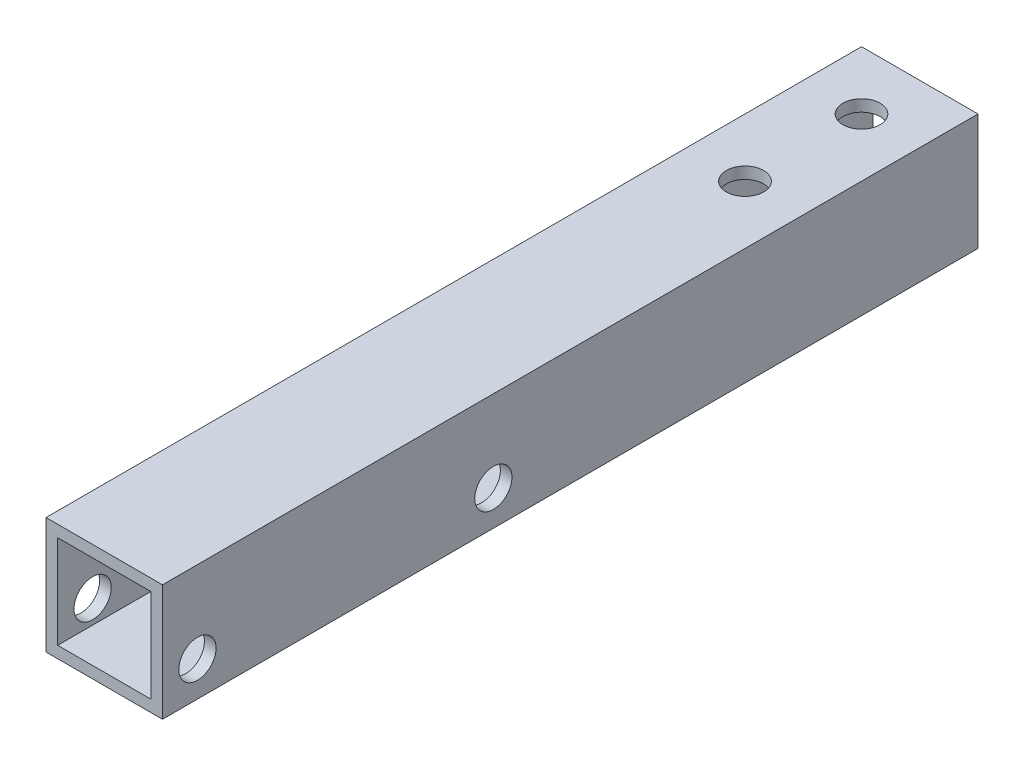
ISO-10303-21;
HEADER;
FILE_DESCRIPTION(('STEP AP214'),'2;1');
FILE_NAME('part.step','',(''),(''),'','','');
FILE_SCHEMA(('AUTOMOTIVE_DESIGN { 1 0 10303 214 1 1 1 1 }'));
ENDSEC;
DATA;
#1=APPLICATION_CONTEXT('core data for automotive mechanical design processes');
#2=APPLICATION_PROTOCOL_DEFINITION('international standard','automotive_design',2000,#1);
#3=PRODUCT_CONTEXT('',#1,'mechanical');
#4=PRODUCT('Part','Part','',(#3));
#5=PRODUCT_RELATED_PRODUCT_CATEGORY('part','',(#4));
#6=PRODUCT_DEFINITION_FORMATION('','',#4);
#7=PRODUCT_DEFINITION_CONTEXT('part definition',#1,'design');
#8=PRODUCT_DEFINITION('design','',#6,#7);
#9=PRODUCT_DEFINITION_SHAPE('','',#8);
#10=(LENGTH_UNIT() NAMED_UNIT(*) SI_UNIT(.MILLI.,.METRE.));
#11=(NAMED_UNIT(*) PLANE_ANGLE_UNIT() SI_UNIT($,.RADIAN.));
#12=(NAMED_UNIT(*) SI_UNIT($,.STERADIAN.) SOLID_ANGLE_UNIT());
#13=UNCERTAINTY_MEASURE_WITH_UNIT(LENGTH_MEASURE(1.E-05),#10,'distance_accuracy_value','');
#14=(GEOMETRIC_REPRESENTATION_CONTEXT(3) GLOBAL_UNCERTAINTY_ASSIGNED_CONTEXT((#13)) GLOBAL_UNIT_ASSIGNED_CONTEXT((#10,
#11,#12)) REPRESENTATION_CONTEXT('',''));
#15=CARTESIAN_POINT('',(0.,0.,0.));
#16=DIRECTION('',(0.,0.,1.));
#17=DIRECTION('',(1.,0.,0.));
#18=AXIS2_PLACEMENT_3D('',#15,#16,#17);
#19=CARTESIAN_POINT('',(0.,0.,70.));
#20=DIRECTION('',(0.,0.,1.));
#21=DIRECTION('',(1.,0.,0.));
#22=AXIS2_PLACEMENT_3D('',#19,#20,#21);
#23=PLANE('',#22);
#24=DIRECTION('',(0.,-1.,0.));
#25=VECTOR('',#24,1.);
#26=CARTESIAN_POINT('',(-5.,5.,70.));
#27=LINE('',#26,#25);
#28=CARTESIAN_POINT('',(-5.,5.,70.));
#29=VERTEX_POINT('',#28);
#30=CARTESIAN_POINT('',(-5.,-5.,70.));
#31=VERTEX_POINT('',#30);
#32=EDGE_CURVE('E164',#29,#31,#27,.T.);
#33=ORIENTED_EDGE('',*,*,#32,.T.);
#34=DIRECTION('',(1.,0.,0.));
#35=VECTOR('',#34,1.);
#36=CARTESIAN_POINT('',(5.,-5.,70.));
#37=LINE('',#36,#35);
#38=CARTESIAN_POINT('',(5.,-5.,70.));
#39=VERTEX_POINT('',#38);
#40=EDGE_CURVE('E167',#31,#39,#37,.T.);
#41=ORIENTED_EDGE('',*,*,#40,.T.);
#42=DIRECTION('',(0.,1.,0.));
#43=VECTOR('',#42,1.);
#44=CARTESIAN_POINT('',(5.,5.,70.));
#45=LINE('',#44,#43);
#46=CARTESIAN_POINT('',(5.,5.,70.));
#47=VERTEX_POINT('',#46);
#48=EDGE_CURVE('E170',#39,#47,#45,.T.);
#49=ORIENTED_EDGE('',*,*,#48,.T.);
#50=DIRECTION('',(-1.,0.,0.));
#51=VECTOR('',#50,1.);
#52=CARTESIAN_POINT('',(5.,5.,70.));
#53=LINE('',#52,#51);
#54=EDGE_CURVE('E172',#47,#29,#53,.T.);
#55=ORIENTED_EDGE('',*,*,#54,.T.);
#56=EDGE_LOOP('',(#33,#41,#49,#55));
#57=FACE_BOUND('',#56,.T.);
#58=DIRECTION('',(1.,0.,0.));
#59=VECTOR('',#58,1.);
#60=CARTESIAN_POINT('',(0.,-4.,70.));
#61=LINE('',#60,#59);
#62=CARTESIAN_POINT('',(-4.,-4.,70.));
#63=VERTEX_POINT('',#62);
#64=CARTESIAN_POINT('',(4.,-4.,70.));
#65=VERTEX_POINT('',#64);
#66=EDGE_CURVE('E134',#63,#65,#61,.T.);
#67=ORIENTED_EDGE('',*,*,#66,.F.);
#68=DIRECTION('',(0.,-1.,0.));
#69=VECTOR('',#68,1.);
#70=CARTESIAN_POINT('',(-4.,0.,70.));
#71=LINE('',#70,#69);
#72=CARTESIAN_POINT('',(-4.,4.,70.));
#73=VERTEX_POINT('',#72);
#74=EDGE_CURVE('E126',#73,#63,#71,.T.);
#75=ORIENTED_EDGE('',*,*,#74,.F.);
#76=DIRECTION('',(-1.,0.,0.));
#77=VECTOR('',#76,1.);
#78=CARTESIAN_POINT('',(0.,4.,70.));
#79=LINE('',#78,#77);
#80=CARTESIAN_POINT('',(4.,4.,70.));
#81=VERTEX_POINT('',#80);
#82=EDGE_CURVE('E148',#81,#73,#79,.T.);
#83=ORIENTED_EDGE('',*,*,#82,.F.);
#84=DIRECTION('',(0.,1.,0.));
#85=VECTOR('',#84,1.);
#86=CARTESIAN_POINT('',(4.,0.,70.));
#87=LINE('',#86,#85);
#88=EDGE_CURVE('E146',#65,#81,#87,.T.);
#89=ORIENTED_EDGE('',*,*,#88,.F.);
#90=EDGE_LOOP('',(#67,#75,#83,#89));
#91=FACE_BOUND('',#90,.T.);
#92=ADVANCED_FACE('F59',(#57,#91),#23,.T.);
#93=CARTESIAN_POINT('',(0.,0.,0.));
#94=DIRECTION('',(0.,0.,1.));
#95=DIRECTION('',(1.,0.,0.));
#96=AXIS2_PLACEMENT_3D('',#93,#94,#95);
#97=PLANE('',#96);
#98=DIRECTION('',(0.,-1.,0.));
#99=VECTOR('',#98,1.);
#100=CARTESIAN_POINT('',(-5.,5.,0.));
#101=LINE('',#100,#99);
#102=CARTESIAN_POINT('',(-5.,5.,0.));
#103=VERTEX_POINT('',#102);
#104=CARTESIAN_POINT('',(-5.,-5.,0.));
#105=VERTEX_POINT('',#104);
#106=EDGE_CURVE('E142',#103,#105,#101,.T.);
#107=ORIENTED_EDGE('',*,*,#106,.F.);
#108=DIRECTION('',(-1.,0.,0.));
#109=VECTOR('',#108,1.);
#110=CARTESIAN_POINT('',(5.,5.,0.));
#111=LINE('',#110,#109);
#112=CARTESIAN_POINT('',(5.,5.,0.));
#113=VERTEX_POINT('',#112);
#114=EDGE_CURVE('E168',#113,#103,#111,.T.);
#115=ORIENTED_EDGE('',*,*,#114,.F.);
#116=DIRECTION('',(0.,1.,0.));
#117=VECTOR('',#116,1.);
#118=CARTESIAN_POINT('',(5.,5.,0.));
#119=LINE('',#118,#117);
#120=CARTESIAN_POINT('',(5.,-5.,0.));
#121=VERTEX_POINT('',#120);
#122=EDGE_CURVE('E179',#121,#113,#119,.T.);
#123=ORIENTED_EDGE('',*,*,#122,.F.);
#124=DIRECTION('',(1.,0.,0.));
#125=VECTOR('',#124,1.);
#126=CARTESIAN_POINT('',(5.,-5.,0.));
#127=LINE('',#126,#125);
#128=EDGE_CURVE('E177',#105,#121,#127,.T.);
#129=ORIENTED_EDGE('',*,*,#128,.F.);
#130=EDGE_LOOP('',(#107,#115,#123,#129));
#131=FACE_BOUND('',#130,.T.);
#132=DIRECTION('',(0.,-1.,0.));
#133=VECTOR('',#132,1.);
#134=CARTESIAN_POINT('',(-4.,0.,0.));
#135=LINE('',#134,#133);
#136=CARTESIAN_POINT('',(-4.,4.,0.));
#137=VERTEX_POINT('',#136);
#138=CARTESIAN_POINT('',(-4.,-4.,0.));
#139=VERTEX_POINT('',#138);
#140=EDGE_CURVE('E84',#137,#139,#135,.T.);
#141=ORIENTED_EDGE('',*,*,#140,.T.);
#142=DIRECTION('',(1.,0.,0.));
#143=VECTOR('',#142,1.);
#144=CARTESIAN_POINT('',(0.,-4.,0.));
#145=LINE('',#144,#143);
#146=CARTESIAN_POINT('',(4.,-4.,0.));
#147=VERTEX_POINT('',#146);
#148=EDGE_CURVE('E141',#139,#147,#145,.T.);
#149=ORIENTED_EDGE('',*,*,#148,.T.);
#150=DIRECTION('',(0.,1.,0.));
#151=VECTOR('',#150,1.);
#152=CARTESIAN_POINT('',(4.,0.,0.));
#153=LINE('',#152,#151);
#154=CARTESIAN_POINT('',(4.,4.,0.));
#155=VERTEX_POINT('',#154);
#156=EDGE_CURVE('E156',#147,#155,#153,.T.);
#157=ORIENTED_EDGE('',*,*,#156,.T.);
#158=DIRECTION('',(-1.,0.,0.));
#159=VECTOR('',#158,1.);
#160=CARTESIAN_POINT('',(0.,4.,0.));
#161=LINE('',#160,#159);
#162=EDGE_CURVE('E135',#155,#137,#161,.T.);
#163=ORIENTED_EDGE('',*,*,#162,.T.);
#164=EDGE_LOOP('',(#141,#149,#157,#163));
#165=FACE_BOUND('',#164,.T.);
#166=ADVANCED_FACE('F259',(#131,#165),#97,.F.);
#167=CARTESIAN_POINT('',(-5.,5.,70.));
#168=DIRECTION('',(1.,0.,0.));
#169=DIRECTION('',(0.,1.,0.));
#170=AXIS2_PLACEMENT_3D('',#167,#168,#169);
#171=PLANE('',#170);
#172=CARTESIAN_POINT('',(-5.,-2.,67.));
#173=DIRECTION('',(-1.,0.,0.));
#174=DIRECTION('',(0.,-1.,0.));
#175=AXIS2_PLACEMENT_3D('',#172,#173,#174);
#176=CIRCLE('',#175,1.60000000000001);
#177=CARTESIAN_POINT('',(-5.,-3.60000000000001,67.));
#178=VERTEX_POINT('',#177);
#179=EDGE_CURVE('E207',#178,#178,#176,.T.);
#180=ORIENTED_EDGE('',*,*,#179,.F.);
#181=EDGE_LOOP('',(#180));
#182=FACE_BOUND('',#181,.T.);
#183=CARTESIAN_POINT('',(-5.,-2.,41.6));
#184=DIRECTION('',(-1.,0.,0.));
#185=DIRECTION('',(0.,-1.,0.));
#186=AXIS2_PLACEMENT_3D('',#183,#184,#185);
#187=CIRCLE('',#186,1.6);
#188=CARTESIAN_POINT('',(-5.,-3.6,41.6));
#189=VERTEX_POINT('',#188);
#190=EDGE_CURVE('E217',#189,#189,#187,.T.);
#191=ORIENTED_EDGE('',*,*,#190,.F.);
#192=EDGE_LOOP('',(#191));
#193=FACE_BOUND('',#192,.T.);
#194=ORIENTED_EDGE('',*,*,#106,.T.);
#195=DIRECTION('',(0.,0.,-1.));
#196=VECTOR('',#195,1.);
#197=CARTESIAN_POINT('',(-5.,-5.,70.));
#198=LINE('',#197,#196);
#199=EDGE_CURVE('E12',#31,#105,#198,.T.);
#200=ORIENTED_EDGE('',*,*,#199,.F.);
#201=ORIENTED_EDGE('',*,*,#32,.F.);
#202=DIRECTION('',(0.,0.,-1.));
#203=VECTOR('',#202,1.);
#204=CARTESIAN_POINT('',(-5.,5.,70.));
#205=LINE('',#204,#203);
#206=EDGE_CURVE('E174',#29,#103,#205,.T.);
#207=ORIENTED_EDGE('',*,*,#206,.T.);
#208=EDGE_LOOP('',(#194,#200,#201,#207));
#209=FACE_BOUND('',#208,.T.);
#210=ADVANCED_FACE('F61',(#182,#193,#209),#171,.F.);
#211=CARTESIAN_POINT('',(5.,-5.,70.));
#212=DIRECTION('',(0.,1.,0.));
#213=DIRECTION('',(-1.,0.,0.));
#214=AXIS2_PLACEMENT_3D('',#211,#212,#213);
#215=PLANE('',#214);
#216=CARTESIAN_POINT('',(0.,-5.,5.));
#217=DIRECTION('',(0.,1.,0.));
#218=DIRECTION('',(-1.,0.,0.));
#219=AXIS2_PLACEMENT_3D('',#216,#217,#218);
#220=CIRCLE('',#219,1.6);
#221=CARTESIAN_POINT('',(-1.6,-5.,5.));
#222=VERTEX_POINT('',#221);
#223=EDGE_CURVE('E193',#222,#222,#220,.T.);
#224=ORIENTED_EDGE('',*,*,#223,.T.);
#225=EDGE_LOOP('',(#224));
#226=FACE_BOUND('',#225,.T.);
#227=CARTESIAN_POINT('',(0.,-5.,15.));
#228=DIRECTION('',(0.,1.,0.));
#229=DIRECTION('',(-1.,0.,0.));
#230=AXIS2_PLACEMENT_3D('',#227,#228,#229);
#231=CIRCLE('',#230,1.6);
#232=CARTESIAN_POINT('',(-1.6,-5.,15.));
#233=VERTEX_POINT('',#232);
#234=EDGE_CURVE('E223',#233,#233,#231,.T.);
#235=ORIENTED_EDGE('',*,*,#234,.T.);
#236=EDGE_LOOP('',(#235));
#237=FACE_BOUND('',#236,.T.);
#238=ORIENTED_EDGE('',*,*,#128,.T.);
#239=DIRECTION('',(0.,0.,-1.));
#240=VECTOR('',#239,1.);
#241=CARTESIAN_POINT('',(5.,-5.,70.));
#242=LINE('',#241,#240);
#243=EDGE_CURVE('E68',#39,#121,#242,.T.);
#244=ORIENTED_EDGE('',*,*,#243,.F.);
#245=ORIENTED_EDGE('',*,*,#40,.F.);
#246=ORIENTED_EDGE('',*,*,#199,.T.);
#247=EDGE_LOOP('',(#238,#244,#245,#246));
#248=FACE_BOUND('',#247,.T.);
#249=ADVANCED_FACE('F274',(#226,#237,#248),#215,.F.);
#250=CARTESIAN_POINT('',(5.,5.,70.));
#251=DIRECTION('',(-1.,0.,0.));
#252=DIRECTION('',(0.,-1.,0.));
#253=AXIS2_PLACEMENT_3D('',#250,#251,#252);
#254=PLANE('',#253);
#255=CARTESIAN_POINT('',(5.,-2.,67.));
#256=DIRECTION('',(-1.,0.,0.));
#257=DIRECTION('',(0.,-1.,0.));
#258=AXIS2_PLACEMENT_3D('',#255,#256,#257);
#259=CIRCLE('',#258,1.60000000000001);
#260=CARTESIAN_POINT('',(5.,-3.60000000000001,67.));
#261=VERTEX_POINT('',#260);
#262=EDGE_CURVE('E201',#261,#261,#259,.T.);
#263=ORIENTED_EDGE('',*,*,#262,.T.);
#264=EDGE_LOOP('',(#263));
#265=FACE_BOUND('',#264,.T.);
#266=CARTESIAN_POINT('',(5.,-2.,41.6));
#267=DIRECTION('',(-1.,0.,0.));
#268=DIRECTION('',(0.,-1.,0.));
#269=AXIS2_PLACEMENT_3D('',#266,#267,#268);
#270=CIRCLE('',#269,1.6);
#271=CARTESIAN_POINT('',(5.,-3.6,41.6));
#272=VERTEX_POINT('',#271);
#273=EDGE_CURVE('E212',#272,#272,#270,.T.);
#274=ORIENTED_EDGE('',*,*,#273,.T.);
#275=EDGE_LOOP('',(#274));
#276=FACE_BOUND('',#275,.T.);
#277=ORIENTED_EDGE('',*,*,#122,.T.);
#278=DIRECTION('',(0.,0.,-1.));
#279=VECTOR('',#278,1.);
#280=CARTESIAN_POINT('',(5.,5.,70.));
#281=LINE('',#280,#279);
#282=EDGE_CURVE('E184',#47,#113,#281,.T.);
#283=ORIENTED_EDGE('',*,*,#282,.F.);
#284=ORIENTED_EDGE('',*,*,#48,.F.);
#285=ORIENTED_EDGE('',*,*,#243,.T.);
#286=EDGE_LOOP('',(#277,#283,#284,#285));
#287=FACE_BOUND('',#286,.T.);
#288=ADVANCED_FACE('F272',(#265,#276,#287),#254,.F.);
#289=CARTESIAN_POINT('',(5.,5.,70.));
#290=DIRECTION('',(0.,-1.,0.));
#291=DIRECTION('',(1.,0.,0.));
#292=AXIS2_PLACEMENT_3D('',#289,#290,#291);
#293=PLANE('',#292);
#294=CARTESIAN_POINT('',(0.,5.,5.));
#295=DIRECTION('',(0.,-1.,0.));
#296=DIRECTION('',(1.,0.,0.));
#297=AXIS2_PLACEMENT_3D('',#294,#295,#296);
#298=CIRCLE('',#297,1.6);
#299=CARTESIAN_POINT('',(-1.6,5.,5.));
#300=VERTEX_POINT('',#299);
#301=EDGE_CURVE('E154',#300,#300,#298,.T.);
#302=ORIENTED_EDGE('',*,*,#301,.T.);
#303=EDGE_LOOP('',(#302));
#304=FACE_BOUND('',#303,.T.);
#305=CARTESIAN_POINT('',(0.,5.,15.));
#306=DIRECTION('',(0.,-1.,0.));
#307=DIRECTION('',(1.,0.,0.));
#308=AXIS2_PLACEMENT_3D('',#305,#306,#307);
#309=CIRCLE('',#308,1.6);
#310=CARTESIAN_POINT('',(-1.6,5.,15.));
#311=VERTEX_POINT('',#310);
#312=EDGE_CURVE('E197',#311,#311,#309,.T.);
#313=ORIENTED_EDGE('',*,*,#312,.T.);
#314=EDGE_LOOP('',(#313));
#315=FACE_BOUND('',#314,.T.);
#316=ORIENTED_EDGE('',*,*,#114,.T.);
#317=ORIENTED_EDGE('',*,*,#206,.F.);
#318=ORIENTED_EDGE('',*,*,#54,.F.);
#319=ORIENTED_EDGE('',*,*,#282,.T.);
#320=EDGE_LOOP('',(#316,#317,#318,#319));
#321=FACE_BOUND('',#320,.T.);
#322=ADVANCED_FACE('F236',(#304,#315,#321),#293,.F.);
#323=CARTESIAN_POINT('',(-4.,0.,70.));
#324=DIRECTION('',(1.,0.,0.));
#325=DIRECTION('',(0.,1.,0.));
#326=AXIS2_PLACEMENT_3D('',#323,#324,#325);
#327=PLANE('',#326);
#328=CARTESIAN_POINT('',(-4.,-2.,67.));
#329=DIRECTION('',(1.,0.,0.));
#330=DIRECTION('',(0.,1.,0.));
#331=AXIS2_PLACEMENT_3D('',#328,#329,#330);
#332=CIRCLE('',#331,1.60000000000001);
#333=CARTESIAN_POINT('',(-4.,-0.399999999999996,67.));
#334=VERTEX_POINT('',#333);
#335=EDGE_CURVE('E220',#334,#334,#332,.T.);
#336=ORIENTED_EDGE('',*,*,#335,.F.);
#337=EDGE_LOOP('',(#336));
#338=FACE_BOUND('',#337,.T.);
#339=CARTESIAN_POINT('',(-4.,-2.,41.6));
#340=DIRECTION('',(1.,0.,0.));
#341=DIRECTION('',(0.,1.,0.));
#342=AXIS2_PLACEMENT_3D('',#339,#340,#341);
#343=CIRCLE('',#342,1.6);
#344=CARTESIAN_POINT('',(-4.,-0.400000000000003,41.6));
#345=VERTEX_POINT('',#344);
#346=EDGE_CURVE('E200',#345,#345,#343,.T.);
#347=ORIENTED_EDGE('',*,*,#346,.F.);
#348=EDGE_LOOP('',(#347));
#349=FACE_BOUND('',#348,.T.);
#350=ORIENTED_EDGE('',*,*,#140,.F.);
#351=DIRECTION('',(0.,0.,-1.));
#352=VECTOR('',#351,1.);
#353=CARTESIAN_POINT('',(-4.,4.,70.));
#354=LINE('',#353,#352);
#355=EDGE_CURVE('E130',#73,#137,#354,.T.);
#356=ORIENTED_EDGE('',*,*,#355,.F.);
#357=ORIENTED_EDGE('',*,*,#74,.T.);
#358=DIRECTION('',(0.,0.,-1.));
#359=VECTOR('',#358,1.);
#360=CARTESIAN_POINT('',(-4.,-4.,70.));
#361=LINE('',#360,#359);
#362=EDGE_CURVE('E129',#63,#139,#361,.T.);
#363=ORIENTED_EDGE('',*,*,#362,.T.);
#364=EDGE_LOOP('',(#350,#356,#357,#363));
#365=FACE_BOUND('',#364,.T.);
#366=ADVANCED_FACE('F128',(#338,#349,#365),#327,.T.);
#367=CARTESIAN_POINT('',(0.,-4.,70.));
#368=DIRECTION('',(0.,1.,0.));
#369=DIRECTION('',(-1.,0.,0.));
#370=AXIS2_PLACEMENT_3D('',#367,#368,#369);
#371=PLANE('',#370);
#372=CARTESIAN_POINT('',(0.,-4.,5.));
#373=DIRECTION('',(0.,1.,0.));
#374=DIRECTION('',(-1.,0.,0.));
#375=AXIS2_PLACEMENT_3D('',#372,#373,#374);
#376=CIRCLE('',#375,1.6);
#377=CARTESIAN_POINT('',(-1.6,-4.,5.));
#378=VERTEX_POINT('',#377);
#379=EDGE_CURVE('E196',#378,#378,#376,.T.);
#380=ORIENTED_EDGE('',*,*,#379,.F.);
#381=EDGE_LOOP('',(#380));
#382=FACE_BOUND('',#381,.T.);
#383=CARTESIAN_POINT('',(0.,-4.,15.));
#384=DIRECTION('',(0.,1.,0.));
#385=DIRECTION('',(-1.,0.,0.));
#386=AXIS2_PLACEMENT_3D('',#383,#384,#385);
#387=CIRCLE('',#386,1.6);
#388=CARTESIAN_POINT('',(-1.6,-4.,15.));
#389=VERTEX_POINT('',#388);
#390=EDGE_CURVE('E192',#389,#389,#387,.T.);
#391=ORIENTED_EDGE('',*,*,#390,.F.);
#392=EDGE_LOOP('',(#391));
#393=FACE_BOUND('',#392,.T.);
#394=ORIENTED_EDGE('',*,*,#148,.F.);
#395=ORIENTED_EDGE('',*,*,#362,.F.);
#396=ORIENTED_EDGE('',*,*,#66,.T.);
#397=DIRECTION('',(0.,0.,-1.));
#398=VECTOR('',#397,1.);
#399=CARTESIAN_POINT('',(4.,-4.,70.));
#400=LINE('',#399,#398);
#401=EDGE_CURVE('E143',#65,#147,#400,.T.);
#402=ORIENTED_EDGE('',*,*,#401,.T.);
#403=EDGE_LOOP('',(#394,#395,#396,#402));
#404=FACE_BOUND('',#403,.T.);
#405=ADVANCED_FACE('F138',(#382,#393,#404),#371,.T.);
#406=CARTESIAN_POINT('',(4.,0.,70.));
#407=DIRECTION('',(-1.,0.,0.));
#408=DIRECTION('',(0.,-1.,0.));
#409=AXIS2_PLACEMENT_3D('',#406,#407,#408);
#410=PLANE('',#409);
#411=CARTESIAN_POINT('',(4.,-2.,67.));
#412=DIRECTION('',(-1.,0.,0.));
#413=DIRECTION('',(0.,-1.,0.));
#414=AXIS2_PLACEMENT_3D('',#411,#412,#413);
#415=CIRCLE('',#414,1.60000000000001);
#416=CARTESIAN_POINT('',(4.,-3.60000000000001,67.));
#417=VERTEX_POINT('',#416);
#418=EDGE_CURVE('E63',#417,#417,#415,.T.);
#419=ORIENTED_EDGE('',*,*,#418,.F.);
#420=EDGE_LOOP('',(#419));
#421=FACE_BOUND('',#420,.T.);
#422=CARTESIAN_POINT('',(4.,-2.,41.6));
#423=DIRECTION('',(-1.,0.,0.));
#424=DIRECTION('',(0.,-1.,0.));
#425=AXIS2_PLACEMENT_3D('',#422,#423,#424);
#426=CIRCLE('',#425,1.6);
#427=CARTESIAN_POINT('',(4.,-3.6,41.6));
#428=VERTEX_POINT('',#427);
#429=EDGE_CURVE('E198',#428,#428,#426,.T.);
#430=ORIENTED_EDGE('',*,*,#429,.F.);
#431=EDGE_LOOP('',(#430));
#432=FACE_BOUND('',#431,.T.);
#433=ORIENTED_EDGE('',*,*,#156,.F.);
#434=ORIENTED_EDGE('',*,*,#401,.F.);
#435=ORIENTED_EDGE('',*,*,#88,.T.);
#436=DIRECTION('',(0.,0.,-1.));
#437=VECTOR('',#436,1.);
#438=CARTESIAN_POINT('',(4.,4.,70.));
#439=LINE('',#438,#437);
#440=EDGE_CURVE('E76',#81,#155,#439,.T.);
#441=ORIENTED_EDGE('',*,*,#440,.T.);
#442=EDGE_LOOP('',(#433,#434,#435,#441));
#443=FACE_BOUND('',#442,.T.);
#444=ADVANCED_FACE('F301',(#421,#432,#443),#410,.T.);
#445=CARTESIAN_POINT('',(0.,4.,70.));
#446=DIRECTION('',(0.,-1.,0.));
#447=DIRECTION('',(1.,0.,0.));
#448=AXIS2_PLACEMENT_3D('',#445,#446,#447);
#449=PLANE('',#448);
#450=CARTESIAN_POINT('',(0.,4.,5.));
#451=DIRECTION('',(0.,-1.,0.));
#452=DIRECTION('',(1.,0.,0.));
#453=AXIS2_PLACEMENT_3D('',#450,#451,#452);
#454=CIRCLE('',#453,1.6);
#455=CARTESIAN_POINT('',(-1.6,4.,5.));
#456=VERTEX_POINT('',#455);
#457=EDGE_CURVE('E194',#456,#456,#454,.T.);
#458=ORIENTED_EDGE('',*,*,#457,.F.);
#459=EDGE_LOOP('',(#458));
#460=FACE_BOUND('',#459,.T.);
#461=CARTESIAN_POINT('',(0.,4.,15.));
#462=DIRECTION('',(0.,-1.,0.));
#463=DIRECTION('',(1.,0.,0.));
#464=AXIS2_PLACEMENT_3D('',#461,#462,#463);
#465=CIRCLE('',#464,1.6);
#466=CARTESIAN_POINT('',(-1.6,4.,15.));
#467=VERTEX_POINT('',#466);
#468=EDGE_CURVE('E189',#467,#467,#465,.T.);
#469=ORIENTED_EDGE('',*,*,#468,.F.);
#470=EDGE_LOOP('',(#469));
#471=FACE_BOUND('',#470,.T.);
#472=ORIENTED_EDGE('',*,*,#162,.F.);
#473=ORIENTED_EDGE('',*,*,#440,.F.);
#474=ORIENTED_EDGE('',*,*,#82,.T.);
#475=ORIENTED_EDGE('',*,*,#355,.T.);
#476=EDGE_LOOP('',(#472,#473,#474,#475));
#477=FACE_BOUND('',#476,.T.);
#478=ADVANCED_FACE('F252',(#460,#471,#477),#449,.T.);
#479=CARTESIAN_POINT('',(0.,-5.,15.));
#480=DIRECTION('',(0.,1.,0.));
#481=DIRECTION('',(-1.,0.,0.));
#482=AXIS2_PLACEMENT_3D('',#479,#480,#481);
#483=CYLINDRICAL_SURFACE('',#482,1.6);
#484=CARTESIAN_POINT('',(-1.6,4.,15.));
#485=CARTESIAN_POINT('',(-1.6,4.01041666666667,15.));
#486=CARTESIAN_POINT('',(-1.6,4.02083333333333,15.));
#487=CARTESIAN_POINT('',(-1.6,4.04166666666667,15.));
#488=CARTESIAN_POINT('',(-1.6,4.05208333333333,15.));
#489=CARTESIAN_POINT('',(-1.6,4.07291666666667,15.));
#490=CARTESIAN_POINT('',(-1.6,4.08333333333333,15.));
#491=CARTESIAN_POINT('',(-1.6,4.10416666666667,15.));
#492=CARTESIAN_POINT('',(-1.6,4.11458333333333,15.));
#493=CARTESIAN_POINT('',(-1.6,4.13541666666667,15.));
#494=CARTESIAN_POINT('',(-1.6,4.14583333333333,15.));
#495=CARTESIAN_POINT('',(-1.6,4.16666666666667,15.));
#496=CARTESIAN_POINT('',(-1.6,4.17708333333333,15.));
#497=CARTESIAN_POINT('',(-1.6,4.19791666666667,15.));
#498=CARTESIAN_POINT('',(-1.6,4.20833333333333,15.));
#499=CARTESIAN_POINT('',(-1.6,4.22916666666667,15.));
#500=CARTESIAN_POINT('',(-1.6,4.23958333333333,15.));
#501=CARTESIAN_POINT('',(-1.6,4.26041666666667,15.));
#502=CARTESIAN_POINT('',(-1.6,4.27083333333333,15.));
#503=CARTESIAN_POINT('',(-1.6,4.29166666666667,15.));
#504=CARTESIAN_POINT('',(-1.6,4.30208333333333,15.));
#505=CARTESIAN_POINT('',(-1.6,4.32291666666667,15.));
#506=CARTESIAN_POINT('',(-1.6,4.33333333333333,15.));
#507=CARTESIAN_POINT('',(-1.6,4.35416666666667,15.));
#508=CARTESIAN_POINT('',(-1.6,4.36458333333333,15.));
#509=CARTESIAN_POINT('',(-1.6,4.38541666666667,15.));
#510=CARTESIAN_POINT('',(-1.6,4.39583333333333,15.));
#511=CARTESIAN_POINT('',(-1.6,4.41666666666667,15.));
#512=CARTESIAN_POINT('',(-1.6,4.42708333333333,15.));
#513=CARTESIAN_POINT('',(-1.6,4.44791666666667,15.));
#514=CARTESIAN_POINT('',(-1.6,4.45833333333333,15.));
#515=CARTESIAN_POINT('',(-1.6,4.47916666666667,15.));
#516=CARTESIAN_POINT('',(-1.6,4.48958333333333,15.));
#517=CARTESIAN_POINT('',(-1.6,4.51041666666667,15.));
#518=CARTESIAN_POINT('',(-1.6,4.52083333333333,15.));
#519=CARTESIAN_POINT('',(-1.6,4.54166666666667,15.));
#520=CARTESIAN_POINT('',(-1.6,4.55208333333333,15.));
#521=CARTESIAN_POINT('',(-1.6,4.57291666666667,15.));
#522=CARTESIAN_POINT('',(-1.6,4.58333333333333,15.));
#523=CARTESIAN_POINT('',(-1.6,4.60416666666667,15.));
#524=CARTESIAN_POINT('',(-1.6,4.61458333333333,15.));
#525=CARTESIAN_POINT('',(-1.6,4.63541666666667,15.));
#526=CARTESIAN_POINT('',(-1.6,4.64583333333333,15.));
#527=CARTESIAN_POINT('',(-1.6,4.66666666666667,15.));
#528=CARTESIAN_POINT('',(-1.6,4.67708333333333,15.));
#529=CARTESIAN_POINT('',(-1.6,4.69791666666667,15.));
#530=CARTESIAN_POINT('',(-1.6,4.70833333333333,15.));
#531=CARTESIAN_POINT('',(-1.6,4.72916666666667,15.));
#532=CARTESIAN_POINT('',(-1.6,4.73958333333333,15.));
#533=CARTESIAN_POINT('',(-1.6,4.76041666666667,15.));
#534=CARTESIAN_POINT('',(-1.6,4.77083333333333,15.));
#535=CARTESIAN_POINT('',(-1.6,4.79166666666667,15.));
#536=CARTESIAN_POINT('',(-1.6,4.80208333333333,15.));
#537=CARTESIAN_POINT('',(-1.6,4.82291666666667,15.));
#538=CARTESIAN_POINT('',(-1.6,4.83333333333333,15.));
#539=CARTESIAN_POINT('',(-1.6,4.85416666666667,15.));
#540=CARTESIAN_POINT('',(-1.6,4.86458333333333,15.));
#541=CARTESIAN_POINT('',(-1.6,4.88541666666667,15.));
#542=CARTESIAN_POINT('',(-1.6,4.89583333333333,15.));
#543=CARTESIAN_POINT('',(-1.6,4.91666666666667,15.));
#544=CARTESIAN_POINT('',(-1.6,4.92708333333333,15.));
#545=CARTESIAN_POINT('',(-1.6,4.94791666666667,15.));
#546=CARTESIAN_POINT('',(-1.6,4.95833333333333,15.));
#547=CARTESIAN_POINT('',(-1.6,4.97916666666667,15.));
#548=CARTESIAN_POINT('',(-1.6,4.98958333333333,15.));
#549=CARTESIAN_POINT('',(-1.6,5.,15.));
#550=B_SPLINE_CURVE_WITH_KNOTS('',3,(#484,#485,#486,#487,#488,#489,#490,#491,#492,#493,#494,
#495,#496,#497,#498,#499,#500,#501,#502,#503,#504,#505,#506,#507,#508,#509,#510,#511,#512,#513,
#514,#515,#516,#517,#518,#519,#520,#521,#522,#523,#524,#525,#526,#527,#528,#529,#530,#531,#532,
#533,#534,#535,#536,#537,#538,#539,#540,#541,#542,#543,#544,#545,#546,#547,#548,#549),
.UNSPECIFIED.,.F.,.F.,(4,2,2,2,2,2,2,2,2,2,2,2,2,2,2,2,2,2,2,2,2,2,2,2,2,2,2,2,2,2,2,2,4),(0.,
0.03125,0.0625000000000001,0.0937500000000001,0.125,0.15625,0.1875,0.21875,0.25,0.28125,0.3125,
0.34375,0.375,0.40625,0.4375,0.46875,0.5,0.53125,0.5625,0.593750000000001,0.625000000000001,
0.656250000000001,0.687500000000001,0.718750000000001,0.750000000000001,0.781250000000001,
0.812500000000001,0.843750000000001,0.875000000000001,0.906250000000001,0.937500000000001,
0.968750000000001,1.),.UNSPECIFIED.);
#551=EDGE_CURVE('BSEAM242',#467,#311,#550,.T.);
#552=ORIENTED_EDGE('',*,*,#468,.T.);
#553=ORIENTED_EDGE('',*,*,#312,.F.);
#554=ORIENTED_EDGE('',*,*,#551,.T.);
#555=ORIENTED_EDGE('',*,*,#551,.F.);
#556=EDGE_LOOP('',(#552,#554,#553,#555));
#557=FACE_BOUND('',#556,.T.);
#558=ADVANCED_FACE('F242',(#557),#483,.F.);
#559=CARTESIAN_POINT('',(0.,-5.,5.));
#560=DIRECTION('',(0.,1.,0.));
#561=DIRECTION('',(-1.,0.,0.));
#562=AXIS2_PLACEMENT_3D('',#559,#560,#561);
#563=CYLINDRICAL_SURFACE('',#562,1.6);
#564=CARTESIAN_POINT('',(-1.6,4.,5.));
#565=CARTESIAN_POINT('',(-1.6,4.01041666666667,5.));
#566=CARTESIAN_POINT('',(-1.6,4.02083333333333,5.));
#567=CARTESIAN_POINT('',(-1.6,4.04166666666667,5.));
#568=CARTESIAN_POINT('',(-1.6,4.05208333333333,5.));
#569=CARTESIAN_POINT('',(-1.6,4.07291666666667,5.));
#570=CARTESIAN_POINT('',(-1.6,4.08333333333333,5.));
#571=CARTESIAN_POINT('',(-1.6,4.10416666666667,5.));
#572=CARTESIAN_POINT('',(-1.6,4.11458333333333,5.));
#573=CARTESIAN_POINT('',(-1.6,4.13541666666667,5.));
#574=CARTESIAN_POINT('',(-1.6,4.14583333333333,5.));
#575=CARTESIAN_POINT('',(-1.6,4.16666666666667,5.));
#576=CARTESIAN_POINT('',(-1.6,4.17708333333333,5.));
#577=CARTESIAN_POINT('',(-1.6,4.19791666666667,5.));
#578=CARTESIAN_POINT('',(-1.6,4.20833333333333,5.));
#579=CARTESIAN_POINT('',(-1.6,4.22916666666667,5.));
#580=CARTESIAN_POINT('',(-1.6,4.23958333333333,5.));
#581=CARTESIAN_POINT('',(-1.6,4.26041666666667,5.));
#582=CARTESIAN_POINT('',(-1.6,4.27083333333333,5.));
#583=CARTESIAN_POINT('',(-1.6,4.29166666666667,5.));
#584=CARTESIAN_POINT('',(-1.6,4.30208333333333,5.));
#585=CARTESIAN_POINT('',(-1.6,4.32291666666667,5.));
#586=CARTESIAN_POINT('',(-1.6,4.33333333333333,5.));
#587=CARTESIAN_POINT('',(-1.6,4.35416666666667,5.));
#588=CARTESIAN_POINT('',(-1.6,4.36458333333333,5.));
#589=CARTESIAN_POINT('',(-1.6,4.38541666666667,5.));
#590=CARTESIAN_POINT('',(-1.6,4.39583333333333,5.));
#591=CARTESIAN_POINT('',(-1.6,4.41666666666667,5.));
#592=CARTESIAN_POINT('',(-1.6,4.42708333333333,5.));
#593=CARTESIAN_POINT('',(-1.6,4.44791666666667,5.));
#594=CARTESIAN_POINT('',(-1.6,4.45833333333333,5.));
#595=CARTESIAN_POINT('',(-1.6,4.47916666666667,5.));
#596=CARTESIAN_POINT('',(-1.6,4.48958333333333,5.));
#597=CARTESIAN_POINT('',(-1.6,4.51041666666667,5.));
#598=CARTESIAN_POINT('',(-1.6,4.52083333333333,5.));
#599=CARTESIAN_POINT('',(-1.6,4.54166666666667,5.));
#600=CARTESIAN_POINT('',(-1.6,4.55208333333333,5.));
#601=CARTESIAN_POINT('',(-1.6,4.57291666666667,5.));
#602=CARTESIAN_POINT('',(-1.6,4.58333333333333,5.));
#603=CARTESIAN_POINT('',(-1.6,4.60416666666667,5.));
#604=CARTESIAN_POINT('',(-1.6,4.61458333333333,5.));
#605=CARTESIAN_POINT('',(-1.6,4.63541666666667,5.));
#606=CARTESIAN_POINT('',(-1.6,4.64583333333333,5.));
#607=CARTESIAN_POINT('',(-1.6,4.66666666666667,5.));
#608=CARTESIAN_POINT('',(-1.6,4.67708333333333,5.));
#609=CARTESIAN_POINT('',(-1.6,4.69791666666667,5.));
#610=CARTESIAN_POINT('',(-1.6,4.70833333333333,5.));
#611=CARTESIAN_POINT('',(-1.6,4.72916666666667,5.));
#612=CARTESIAN_POINT('',(-1.6,4.73958333333333,5.));
#613=CARTESIAN_POINT('',(-1.6,4.76041666666667,5.));
#614=CARTESIAN_POINT('',(-1.6,4.77083333333333,5.));
#615=CARTESIAN_POINT('',(-1.6,4.79166666666667,5.));
#616=CARTESIAN_POINT('',(-1.6,4.80208333333333,5.));
#617=CARTESIAN_POINT('',(-1.6,4.82291666666667,5.));
#618=CARTESIAN_POINT('',(-1.6,4.83333333333333,5.));
#619=CARTESIAN_POINT('',(-1.6,4.85416666666667,5.));
#620=CARTESIAN_POINT('',(-1.6,4.86458333333333,5.));
#621=CARTESIAN_POINT('',(-1.6,4.88541666666667,5.));
#622=CARTESIAN_POINT('',(-1.6,4.89583333333333,5.));
#623=CARTESIAN_POINT('',(-1.6,4.91666666666667,5.));
#624=CARTESIAN_POINT('',(-1.6,4.92708333333333,5.));
#625=CARTESIAN_POINT('',(-1.6,4.94791666666667,5.));
#626=CARTESIAN_POINT('',(-1.6,4.95833333333333,5.));
#627=CARTESIAN_POINT('',(-1.6,4.97916666666667,5.));
#628=CARTESIAN_POINT('',(-1.6,4.98958333333333,5.));
#629=CARTESIAN_POINT('',(-1.6,5.,5.));
#630=B_SPLINE_CURVE_WITH_KNOTS('',3,(#564,#565,#566,#567,#568,#569,#570,#571,#572,#573,#574,
#575,#576,#577,#578,#579,#580,#581,#582,#583,#584,#585,#586,#587,#588,#589,#590,#591,#592,#593,
#594,#595,#596,#597,#598,#599,#600,#601,#602,#603,#604,#605,#606,#607,#608,#609,#610,#611,#612,
#613,#614,#615,#616,#617,#618,#619,#620,#621,#622,#623,#624,#625,#626,#627,#628,#629),
.UNSPECIFIED.,.F.,.F.,(4,2,2,2,2,2,2,2,2,2,2,2,2,2,2,2,2,2,2,2,2,2,2,2,2,2,2,2,2,2,2,2,4),(0.,
0.03125,0.0625000000000001,0.0937500000000001,0.125,0.15625,0.1875,0.21875,0.25,0.28125,0.3125,
0.34375,0.375,0.40625,0.4375,0.46875,0.5,0.53125,0.5625,0.593750000000001,0.625000000000001,
0.656250000000001,0.687500000000001,0.718750000000001,0.750000000000001,0.781250000000001,
0.812500000000001,0.843750000000001,0.875000000000001,0.906250000000001,0.937500000000001,
0.968750000000001,1.),.UNSPECIFIED.);
#631=EDGE_CURVE('BSEAM239',#456,#300,#630,.T.);
#632=ORIENTED_EDGE('',*,*,#457,.T.);
#633=ORIENTED_EDGE('',*,*,#301,.F.);
#634=ORIENTED_EDGE('',*,*,#631,.T.);
#635=ORIENTED_EDGE('',*,*,#631,.F.);
#636=EDGE_LOOP('',(#632,#634,#633,#635));
#637=FACE_BOUND('',#636,.T.);
#638=ADVANCED_FACE('F239',(#637),#563,.F.);
#639=CARTESIAN_POINT('',(-1.6,-4.,15.));
#640=CARTESIAN_POINT('',(-1.6,-4.01041666666667,15.));
#641=CARTESIAN_POINT('',(-1.6,-4.02083333333333,15.));
#642=CARTESIAN_POINT('',(-1.6,-4.04166666666667,15.));
#643=CARTESIAN_POINT('',(-1.6,-4.05208333333333,15.));
#644=CARTESIAN_POINT('',(-1.6,-4.07291666666667,15.));
#645=CARTESIAN_POINT('',(-1.6,-4.08333333333333,15.));
#646=CARTESIAN_POINT('',(-1.6,-4.10416666666667,15.));
#647=CARTESIAN_POINT('',(-1.6,-4.11458333333333,15.));
#648=CARTESIAN_POINT('',(-1.6,-4.13541666666667,15.));
#649=CARTESIAN_POINT('',(-1.6,-4.14583333333333,15.));
#650=CARTESIAN_POINT('',(-1.6,-4.16666666666667,15.));
#651=CARTESIAN_POINT('',(-1.6,-4.17708333333333,15.));
#652=CARTESIAN_POINT('',(-1.6,-4.19791666666667,15.));
#653=CARTESIAN_POINT('',(-1.6,-4.20833333333333,15.));
#654=CARTESIAN_POINT('',(-1.6,-4.22916666666667,15.));
#655=CARTESIAN_POINT('',(-1.6,-4.23958333333333,15.));
#656=CARTESIAN_POINT('',(-1.6,-4.26041666666667,15.));
#657=CARTESIAN_POINT('',(-1.6,-4.27083333333333,15.));
#658=CARTESIAN_POINT('',(-1.6,-4.29166666666667,15.));
#659=CARTESIAN_POINT('',(-1.6,-4.30208333333333,15.));
#660=CARTESIAN_POINT('',(-1.6,-4.32291666666667,15.));
#661=CARTESIAN_POINT('',(-1.6,-4.33333333333333,15.));
#662=CARTESIAN_POINT('',(-1.6,-4.35416666666667,15.));
#663=CARTESIAN_POINT('',(-1.6,-4.36458333333333,15.));
#664=CARTESIAN_POINT('',(-1.6,-4.38541666666667,15.));
#665=CARTESIAN_POINT('',(-1.6,-4.39583333333333,15.));
#666=CARTESIAN_POINT('',(-1.6,-4.41666666666667,15.));
#667=CARTESIAN_POINT('',(-1.6,-4.42708333333333,15.));
#668=CARTESIAN_POINT('',(-1.6,-4.44791666666667,15.));
#669=CARTESIAN_POINT('',(-1.6,-4.45833333333334,15.));
#670=CARTESIAN_POINT('',(-1.6,-4.47916666666667,15.));
#671=CARTESIAN_POINT('',(-1.6,-4.48958333333334,15.));
#672=CARTESIAN_POINT('',(-1.6,-4.51041666666667,15.));
#673=CARTESIAN_POINT('',(-1.6,-4.52083333333334,15.));
#674=CARTESIAN_POINT('',(-1.6,-4.54166666666667,15.));
#675=CARTESIAN_POINT('',(-1.6,-4.55208333333334,15.));
#676=CARTESIAN_POINT('',(-1.6,-4.57291666666667,15.));
#677=CARTESIAN_POINT('',(-1.6,-4.58333333333334,15.));
#678=CARTESIAN_POINT('',(-1.6,-4.60416666666667,15.));
#679=CARTESIAN_POINT('',(-1.6,-4.61458333333334,15.));
#680=CARTESIAN_POINT('',(-1.6,-4.63541666666667,15.));
#681=CARTESIAN_POINT('',(-1.6,-4.64583333333334,15.));
#682=CARTESIAN_POINT('',(-1.6,-4.66666666666667,15.));
#683=CARTESIAN_POINT('',(-1.6,-4.67708333333334,15.));
#684=CARTESIAN_POINT('',(-1.6,-4.69791666666667,15.));
#685=CARTESIAN_POINT('',(-1.6,-4.70833333333334,15.));
#686=CARTESIAN_POINT('',(-1.6,-4.72916666666667,15.));
#687=CARTESIAN_POINT('',(-1.6,-4.73958333333334,15.));
#688=CARTESIAN_POINT('',(-1.6,-4.76041666666667,15.));
#689=CARTESIAN_POINT('',(-1.6,-4.77083333333334,15.));
#690=CARTESIAN_POINT('',(-1.6,-4.79166666666667,15.));
#691=CARTESIAN_POINT('',(-1.6,-4.80208333333334,15.));
#692=CARTESIAN_POINT('',(-1.6,-4.82291666666667,15.));
#693=CARTESIAN_POINT('',(-1.6,-4.83333333333334,15.));
#694=CARTESIAN_POINT('',(-1.6,-4.85416666666667,15.));
#695=CARTESIAN_POINT('',(-1.6,-4.86458333333334,15.));
#696=CARTESIAN_POINT('',(-1.6,-4.88541666666667,15.));
#697=CARTESIAN_POINT('',(-1.6,-4.89583333333334,15.));
#698=CARTESIAN_POINT('',(-1.6,-4.91666666666667,15.));
#699=CARTESIAN_POINT('',(-1.6,-4.92708333333334,15.));
#700=CARTESIAN_POINT('',(-1.6,-4.94791666666667,15.));
#701=CARTESIAN_POINT('',(-1.6,-4.95833333333334,15.));
#702=CARTESIAN_POINT('',(-1.6,-4.97916666666667,15.));
#703=CARTESIAN_POINT('',(-1.6,-4.98958333333334,15.));
#704=CARTESIAN_POINT('',(-1.6,-5.,15.));
#705=B_SPLINE_CURVE_WITH_KNOTS('',3,(#639,#640,#641,#642,#643,#644,#645,#646,#647,#648,#649,
#650,#651,#652,#653,#654,#655,#656,#657,#658,#659,#660,#661,#662,#663,#664,#665,#666,#667,#668,
#669,#670,#671,#672,#673,#674,#675,#676,#677,#678,#679,#680,#681,#682,#683,#684,#685,#686,#687,
#688,#689,#690,#691,#692,#693,#694,#695,#696,#697,#698,#699,#700,#701,#702,#703,#704),
.UNSPECIFIED.,.F.,.F.,(4,2,2,2,2,2,2,2,2,2,2,2,2,2,2,2,2,2,2,2,2,2,2,2,2,2,2,2,2,2,2,2,4),(0.,
0.03125,0.0625000000000001,0.0937500000000001,0.125,0.15625,0.1875,0.21875,0.25,0.28125,0.3125,
0.34375,0.375,0.40625,0.437500000000001,0.468750000000001,0.500000000000001,0.531250000000001,
0.562500000000001,0.593750000000001,0.625000000000001,0.656250000000001,0.687500000000001,
0.718750000000002,0.750000000000002,0.781250000000002,0.812500000000002,0.843750000000002,
0.875000000000002,0.906250000000002,0.937500000000002,0.968750000000003,1.),.UNSPECIFIED.);
#706=EDGE_CURVE('BSEAM241',#389,#233,#705,.T.);
#707=ORIENTED_EDGE('',*,*,#390,.T.);
#708=ORIENTED_EDGE('',*,*,#234,.F.);
#709=ORIENTED_EDGE('',*,*,#706,.T.);
#710=ORIENTED_EDGE('',*,*,#706,.F.);
#711=EDGE_LOOP('',(#707,#709,#708,#710));
#712=FACE_BOUND('',#711,.T.);
#713=ADVANCED_FACE('F241',(#712),#483,.F.);
#714=CARTESIAN_POINT('',(-1.6,-4.,5.));
#715=CARTESIAN_POINT('',(-1.6,-4.01041666666667,5.));
#716=CARTESIAN_POINT('',(-1.6,-4.02083333333333,5.));
#717=CARTESIAN_POINT('',(-1.6,-4.04166666666667,5.));
#718=CARTESIAN_POINT('',(-1.6,-4.05208333333333,5.));
#719=CARTESIAN_POINT('',(-1.6,-4.07291666666667,5.));
#720=CARTESIAN_POINT('',(-1.6,-4.08333333333333,5.));
#721=CARTESIAN_POINT('',(-1.6,-4.10416666666667,5.));
#722=CARTESIAN_POINT('',(-1.6,-4.11458333333333,5.));
#723=CARTESIAN_POINT('',(-1.6,-4.13541666666667,5.));
#724=CARTESIAN_POINT('',(-1.6,-4.14583333333333,5.));
#725=CARTESIAN_POINT('',(-1.6,-4.16666666666667,5.));
#726=CARTESIAN_POINT('',(-1.6,-4.17708333333333,5.));
#727=CARTESIAN_POINT('',(-1.6,-4.19791666666667,5.));
#728=CARTESIAN_POINT('',(-1.6,-4.20833333333333,5.));
#729=CARTESIAN_POINT('',(-1.6,-4.22916666666667,5.));
#730=CARTESIAN_POINT('',(-1.6,-4.23958333333333,5.));
#731=CARTESIAN_POINT('',(-1.6,-4.26041666666667,5.));
#732=CARTESIAN_POINT('',(-1.6,-4.27083333333333,5.));
#733=CARTESIAN_POINT('',(-1.6,-4.29166666666667,5.));
#734=CARTESIAN_POINT('',(-1.6,-4.30208333333333,5.));
#735=CARTESIAN_POINT('',(-1.6,-4.32291666666667,5.));
#736=CARTESIAN_POINT('',(-1.6,-4.33333333333333,5.));
#737=CARTESIAN_POINT('',(-1.6,-4.35416666666667,5.));
#738=CARTESIAN_POINT('',(-1.6,-4.36458333333333,5.));
#739=CARTESIAN_POINT('',(-1.6,-4.38541666666667,5.));
#740=CARTESIAN_POINT('',(-1.6,-4.39583333333333,5.));
#741=CARTESIAN_POINT('',(-1.6,-4.41666666666667,5.));
#742=CARTESIAN_POINT('',(-1.6,-4.42708333333333,5.));
#743=CARTESIAN_POINT('',(-1.6,-4.44791666666667,5.));
#744=CARTESIAN_POINT('',(-1.6,-4.45833333333334,5.));
#745=CARTESIAN_POINT('',(-1.6,-4.47916666666667,5.));
#746=CARTESIAN_POINT('',(-1.6,-4.48958333333334,5.));
#747=CARTESIAN_POINT('',(-1.6,-4.51041666666667,5.));
#748=CARTESIAN_POINT('',(-1.6,-4.52083333333334,5.));
#749=CARTESIAN_POINT('',(-1.6,-4.54166666666667,5.));
#750=CARTESIAN_POINT('',(-1.6,-4.55208333333334,5.));
#751=CARTESIAN_POINT('',(-1.6,-4.57291666666667,5.));
#752=CARTESIAN_POINT('',(-1.6,-4.58333333333334,5.));
#753=CARTESIAN_POINT('',(-1.6,-4.60416666666667,5.));
#754=CARTESIAN_POINT('',(-1.6,-4.61458333333334,5.));
#755=CARTESIAN_POINT('',(-1.6,-4.63541666666667,5.));
#756=CARTESIAN_POINT('',(-1.6,-4.64583333333334,5.));
#757=CARTESIAN_POINT('',(-1.6,-4.66666666666667,5.));
#758=CARTESIAN_POINT('',(-1.6,-4.67708333333334,5.));
#759=CARTESIAN_POINT('',(-1.6,-4.69791666666667,5.));
#760=CARTESIAN_POINT('',(-1.6,-4.70833333333334,5.));
#761=CARTESIAN_POINT('',(-1.6,-4.72916666666667,5.));
#762=CARTESIAN_POINT('',(-1.6,-4.73958333333334,5.));
#763=CARTESIAN_POINT('',(-1.6,-4.76041666666667,5.));
#764=CARTESIAN_POINT('',(-1.6,-4.77083333333334,5.));
#765=CARTESIAN_POINT('',(-1.6,-4.79166666666667,5.));
#766=CARTESIAN_POINT('',(-1.6,-4.80208333333334,5.));
#767=CARTESIAN_POINT('',(-1.6,-4.82291666666667,5.));
#768=CARTESIAN_POINT('',(-1.6,-4.83333333333334,5.));
#769=CARTESIAN_POINT('',(-1.6,-4.85416666666667,5.));
#770=CARTESIAN_POINT('',(-1.6,-4.86458333333334,5.));
#771=CARTESIAN_POINT('',(-1.6,-4.88541666666667,5.));
#772=CARTESIAN_POINT('',(-1.6,-4.89583333333334,5.));
#773=CARTESIAN_POINT('',(-1.6,-4.91666666666667,5.));
#774=CARTESIAN_POINT('',(-1.6,-4.92708333333334,5.));
#775=CARTESIAN_POINT('',(-1.6,-4.94791666666667,5.));
#776=CARTESIAN_POINT('',(-1.6,-4.95833333333334,5.));
#777=CARTESIAN_POINT('',(-1.6,-4.97916666666667,5.));
#778=CARTESIAN_POINT('',(-1.6,-4.98958333333334,5.));
#779=CARTESIAN_POINT('',(-1.6,-5.,5.));
#780=B_SPLINE_CURVE_WITH_KNOTS('',3,(#714,#715,#716,#717,#718,#719,#720,#721,#722,#723,#724,
#725,#726,#727,#728,#729,#730,#731,#732,#733,#734,#735,#736,#737,#738,#739,#740,#741,#742,#743,
#744,#745,#746,#747,#748,#749,#750,#751,#752,#753,#754,#755,#756,#757,#758,#759,#760,#761,#762,
#763,#764,#765,#766,#767,#768,#769,#770,#771,#772,#773,#774,#775,#776,#777,#778,#779),
.UNSPECIFIED.,.F.,.F.,(4,2,2,2,2,2,2,2,2,2,2,2,2,2,2,2,2,2,2,2,2,2,2,2,2,2,2,2,2,2,2,2,4),(0.,
0.03125,0.0625000000000001,0.0937500000000001,0.125,0.15625,0.1875,0.21875,0.25,0.28125,0.3125,
0.34375,0.375,0.40625,0.437500000000001,0.468750000000001,0.500000000000001,0.531250000000001,
0.562500000000001,0.593750000000001,0.625000000000001,0.656250000000001,0.687500000000001,
0.718750000000002,0.750000000000002,0.781250000000002,0.812500000000002,0.843750000000002,
0.875000000000002,0.906250000000002,0.937500000000002,0.968750000000003,1.),.UNSPECIFIED.);
#781=EDGE_CURVE('BSEAM245',#378,#222,#780,.T.);
#782=ORIENTED_EDGE('',*,*,#379,.T.);
#783=ORIENTED_EDGE('',*,*,#223,.F.);
#784=ORIENTED_EDGE('',*,*,#781,.T.);
#785=ORIENTED_EDGE('',*,*,#781,.F.);
#786=EDGE_LOOP('',(#782,#784,#783,#785));
#787=FACE_BOUND('',#786,.T.);
#788=ADVANCED_FACE('F245',(#787),#563,.F.);
#789=CARTESIAN_POINT('',(5.,-2.,41.6));
#790=DIRECTION('',(-1.,0.,0.));
#791=DIRECTION('',(0.,-1.,0.));
#792=AXIS2_PLACEMENT_3D('',#789,#790,#791);
#793=CYLINDRICAL_SURFACE('',#792,1.6);
#794=ORIENTED_EDGE('',*,*,#429,.T.);
#795=EDGE_LOOP('',(#794));
#796=FACE_BOUND('',#795,.T.);
#797=ORIENTED_EDGE('',*,*,#273,.F.);
#798=EDGE_LOOP('',(#797));
#799=FACE_BOUND('',#798,.T.);
#800=ADVANCED_FACE('F256',(#796,#799),#793,.F.);
#801=CARTESIAN_POINT('',(5.,-2.,67.));
#802=DIRECTION('',(-1.,0.,0.));
#803=DIRECTION('',(0.,-1.,0.));
#804=AXIS2_PLACEMENT_3D('',#801,#802,#803);
#805=CYLINDRICAL_SURFACE('',#804,1.60000000000001);
#806=ORIENTED_EDGE('',*,*,#418,.T.);
#807=EDGE_LOOP('',(#806));
#808=FACE_BOUND('',#807,.T.);
#809=ORIENTED_EDGE('',*,*,#262,.F.);
#810=EDGE_LOOP('',(#809));
#811=FACE_BOUND('',#810,.T.);
#812=ADVANCED_FACE('F332',(#808,#811),#805,.F.);
#813=ORIENTED_EDGE('',*,*,#346,.T.);
#814=EDGE_LOOP('',(#813));
#815=FACE_BOUND('',#814,.T.);
#816=ORIENTED_EDGE('',*,*,#190,.T.);
#817=EDGE_LOOP('',(#816));
#818=FACE_BOUND('',#817,.T.);
#819=ADVANCED_FACE('F328',(#815,#818),#793,.F.);
#820=ORIENTED_EDGE('',*,*,#335,.T.);
#821=EDGE_LOOP('',(#820));
#822=FACE_BOUND('',#821,.T.);
#823=ORIENTED_EDGE('',*,*,#179,.T.);
#824=EDGE_LOOP('',(#823));
#825=FACE_BOUND('',#824,.T.);
#826=ADVANCED_FACE('F331',(#822,#825),#805,.F.);
#827=CLOSED_SHELL('',(#92,#166,#210,#249,#288,#322,#366,#405,#444,#478,#558,#638,#713,#788,#800,
#812,#819,#826));
#828=MANIFOLD_SOLID_BREP('B2',#827);
#829=ADVANCED_BREP_SHAPE_REPRESENTATION('',(#18,#828),#14);
#830=SHAPE_DEFINITION_REPRESENTATION(#9,#829);
ENDSEC;
END-ISO-10303-21;
